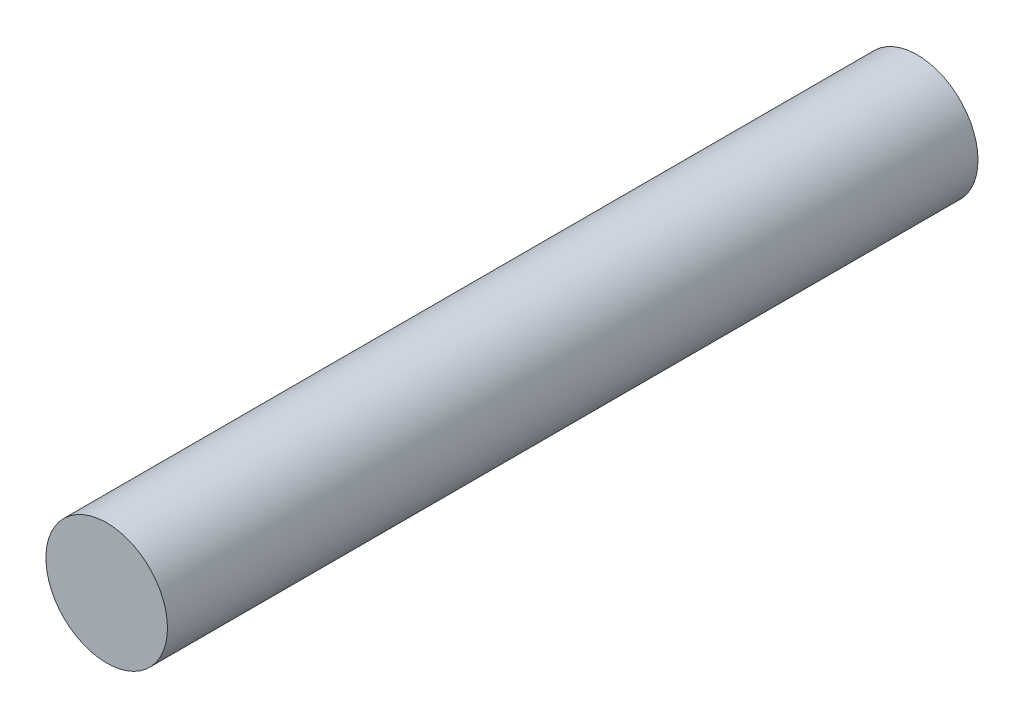
ISO-10303-21;
HEADER;
FILE_DESCRIPTION(('STEP AP214'),'2;1');
FILE_NAME('part.step','',(''),(''),'','','');
FILE_SCHEMA(('AUTOMOTIVE_DESIGN { 1 0 10303 214 1 1 1 1 }'));
ENDSEC;
DATA;
#1=APPLICATION_CONTEXT('core data for automotive mechanical design processes');
#2=APPLICATION_PROTOCOL_DEFINITION('international standard','automotive_design',2000,#1);
#3=PRODUCT_CONTEXT('',#1,'mechanical');
#4=PRODUCT('Part','Part','',(#3));
#5=PRODUCT_RELATED_PRODUCT_CATEGORY('part','',(#4));
#6=PRODUCT_DEFINITION_FORMATION('','',#4);
#7=PRODUCT_DEFINITION_CONTEXT('part definition',#1,'design');
#8=PRODUCT_DEFINITION('design','',#6,#7);
#9=PRODUCT_DEFINITION_SHAPE('','',#8);
#10=(LENGTH_UNIT() NAMED_UNIT(*) SI_UNIT(.MILLI.,.METRE.));
#11=(NAMED_UNIT(*) PLANE_ANGLE_UNIT() SI_UNIT($,.RADIAN.));
#12=(NAMED_UNIT(*) SI_UNIT($,.STERADIAN.) SOLID_ANGLE_UNIT());
#13=UNCERTAINTY_MEASURE_WITH_UNIT(LENGTH_MEASURE(1.E-05),#10,'distance_accuracy_value','');
#14=(GEOMETRIC_REPRESENTATION_CONTEXT(3) GLOBAL_UNCERTAINTY_ASSIGNED_CONTEXT((#13)) GLOBAL_UNIT_ASSIGNED_CONTEXT((#10,
#11,#12)) REPRESENTATION_CONTEXT('',''));
#15=CARTESIAN_POINT('',(0.,0.,0.));
#16=DIRECTION('',(0.,0.,1.));
#17=DIRECTION('',(1.,0.,0.));
#18=AXIS2_PLACEMENT_3D('',#15,#16,#17);
#19=CARTESIAN_POINT('',(0.,0.,50.));
#20=DIRECTION('',(0.,0.,-1.));
#21=DIRECTION('',(-1.,0.,0.));
#22=AXIS2_PLACEMENT_3D('',#19,#20,#21);
#23=CYLINDRICAL_SURFACE('',#22,3.75);
#24=CARTESIAN_POINT('',(0.,0.,50.));
#25=DIRECTION('',(0.,0.,1.));
#26=DIRECTION('',(1.,0.,0.));
#27=AXIS2_PLACEMENT_3D('',#24,#25,#26);
#28=CIRCLE('',#27,3.75);
#29=CARTESIAN_POINT('',(3.75,0.,50.));
#30=VERTEX_POINT('',#29);
#31=EDGE_CURVE('E10',#30,#30,#28,.T.);
#32=ORIENTED_EDGE('',*,*,#31,.F.);
#33=EDGE_LOOP('',(#32));
#34=FACE_BOUND('',#33,.T.);
#35=CARTESIAN_POINT('',(0.,0.,0.));
#36=DIRECTION('',(0.,0.,1.));
#37=DIRECTION('',(1.,0.,0.));
#38=AXIS2_PLACEMENT_3D('',#35,#36,#37);
#39=CIRCLE('',#38,3.75);
#40=CARTESIAN_POINT('',(3.75,0.,0.));
#41=VERTEX_POINT('',#40);
#42=EDGE_CURVE('E40',#41,#41,#39,.T.);
#43=ORIENTED_EDGE('',*,*,#42,.T.);
#44=EDGE_LOOP('',(#43));
#45=FACE_BOUND('',#44,.T.);
#46=ADVANCED_FACE('F37',(#34,#45),#23,.T.);
#47=CARTESIAN_POINT('',(0.,0.,50.));
#48=DIRECTION('',(0.,0.,1.));
#49=DIRECTION('',(1.,0.,0.));
#50=AXIS2_PLACEMENT_3D('',#47,#48,#49);
#51=PLANE('',#50);
#52=ORIENTED_EDGE('',*,*,#31,.T.);
#53=EDGE_LOOP('',(#52));
#54=FACE_BOUND('',#53,.T.);
#55=ADVANCED_FACE('F52',(#54),#51,.T.);
#56=CARTESIAN_POINT('',(0.,0.,0.));
#57=DIRECTION('',(0.,0.,1.));
#58=DIRECTION('',(1.,0.,0.));
#59=AXIS2_PLACEMENT_3D('',#56,#57,#58);
#60=PLANE('',#59);
#61=ORIENTED_EDGE('',*,*,#42,.F.);
#62=EDGE_LOOP('',(#61));
#63=FACE_BOUND('',#62,.T.);
#64=ADVANCED_FACE('F50',(#63),#60,.F.);
#65=CLOSED_SHELL('',(#46,#55,#64));
#66=MANIFOLD_SOLID_BREP('B2',#65);
#67=ADVANCED_BREP_SHAPE_REPRESENTATION('',(#18,#66),#14);
#68=SHAPE_DEFINITION_REPRESENTATION(#9,#67);
ENDSEC;
END-ISO-10303-21;
